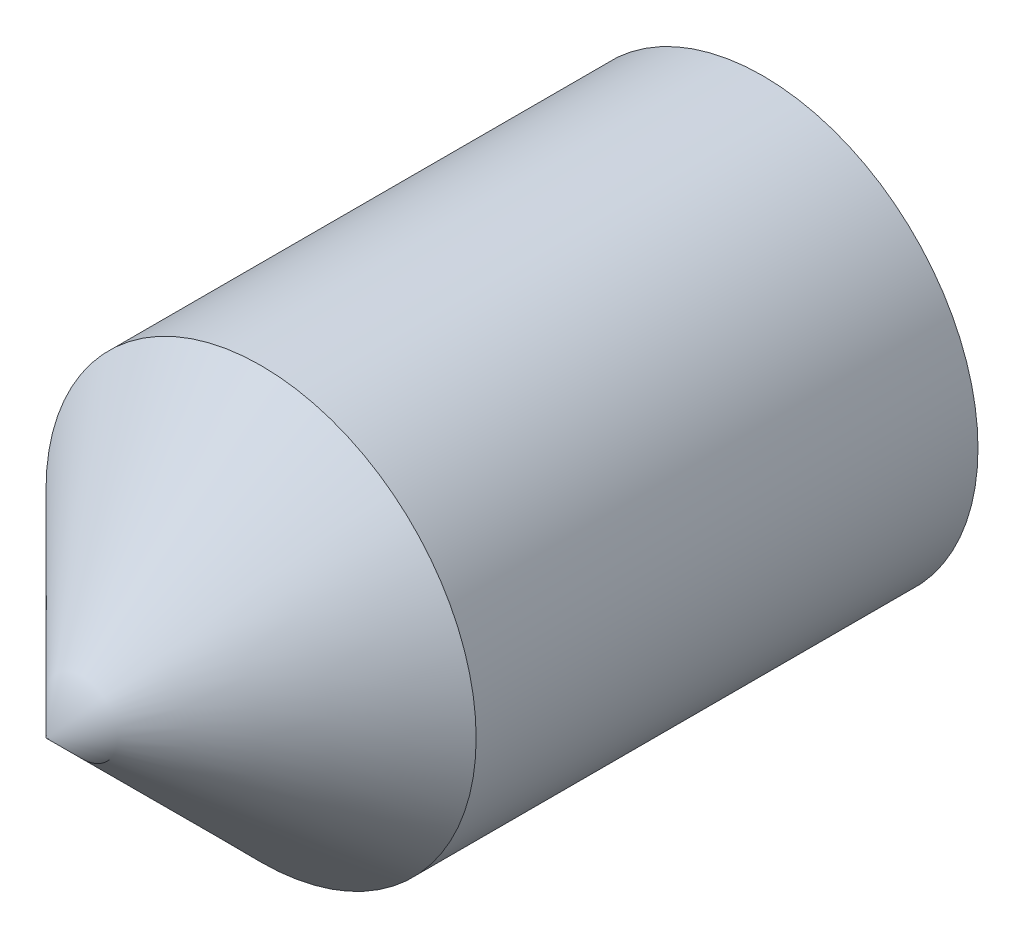
ISO-10303-21;
HEADER;
FILE_DESCRIPTION(('STEP AP214'),'2;1');
FILE_NAME('part.step','',(''),(''),'','','');
FILE_SCHEMA(('AUTOMOTIVE_DESIGN { 1 0 10303 214 1 1 1 1 }'));
ENDSEC;
DATA;
#1=APPLICATION_CONTEXT('core data for automotive mechanical design processes');
#2=APPLICATION_PROTOCOL_DEFINITION('international standard','automotive_design',2000,#1);
#3=PRODUCT_CONTEXT('',#1,'mechanical');
#4=PRODUCT('Part','Part','',(#3));
#5=PRODUCT_RELATED_PRODUCT_CATEGORY('part','',(#4));
#6=PRODUCT_DEFINITION_FORMATION('','',#4);
#7=PRODUCT_DEFINITION_CONTEXT('part definition',#1,'design');
#8=PRODUCT_DEFINITION('design','',#6,#7);
#9=PRODUCT_DEFINITION_SHAPE('','',#8);
#10=(LENGTH_UNIT() NAMED_UNIT(*) SI_UNIT(.MILLI.,.METRE.));
#11=(NAMED_UNIT(*) PLANE_ANGLE_UNIT() SI_UNIT($,.RADIAN.));
#12=(NAMED_UNIT(*) SI_UNIT($,.STERADIAN.) SOLID_ANGLE_UNIT());
#13=UNCERTAINTY_MEASURE_WITH_UNIT(LENGTH_MEASURE(1.E-05),#10,'distance_accuracy_value','');
#14=(GEOMETRIC_REPRESENTATION_CONTEXT(3) GLOBAL_UNCERTAINTY_ASSIGNED_CONTEXT((#13)) GLOBAL_UNIT_ASSIGNED_CONTEXT((#10,
#11,#12)) REPRESENTATION_CONTEXT('',''));
#15=CARTESIAN_POINT('',(0.,0.,0.));
#16=DIRECTION('',(0.,0.,1.));
#17=DIRECTION('',(1.,0.,0.));
#18=AXIS2_PLACEMENT_3D('',#15,#16,#17);
#19=CARTESIAN_POINT('',(0.,0.,25.));
#20=DIRECTION('',(0.,0.,-1.));
#21=DIRECTION('',(-1.,0.,0.));
#22=AXIS2_PLACEMENT_3D('',#19,#20,#21);
#23=CYLINDRICAL_SURFACE('',#22,7.5);
#24=CARTESIAN_POINT('',(0.,0.,17.5));
#25=DIRECTION('',(0.,0.,1.));
#26=DIRECTION('',(1.,0.,0.));
#27=AXIS2_PLACEMENT_3D('',#24,#25,#26);
#28=CIRCLE('',#27,7.5);
#29=CARTESIAN_POINT('',(7.5,0.,17.5));
#30=VERTEX_POINT('',#29);
#31=EDGE_CURVE('E11',#30,#30,#28,.F.);
#32=ORIENTED_EDGE('',*,*,#31,.T.);
#33=EDGE_LOOP('',(#32));
#34=FACE_BOUND('',#33,.T.);
#35=CARTESIAN_POINT('',(0.,0.,0.));
#36=DIRECTION('',(0.,0.,1.));
#37=DIRECTION('',(1.,0.,0.));
#38=AXIS2_PLACEMENT_3D('',#35,#36,#37);
#39=CIRCLE('',#38,7.5);
#40=CARTESIAN_POINT('',(7.5,0.,0.));
#41=VERTEX_POINT('',#40);
#42=EDGE_CURVE('E54',#41,#41,#39,.T.);
#43=ORIENTED_EDGE('',*,*,#42,.T.);
#44=EDGE_LOOP('',(#43));
#45=FACE_BOUND('',#44,.T.);
#46=ADVANCED_FACE('F45',(#34,#45),#23,.T.);
#47=CARTESIAN_POINT('',(0.,0.,0.));
#48=DIRECTION('',(0.,0.,1.));
#49=DIRECTION('',(1.,0.,0.));
#50=AXIS2_PLACEMENT_3D('',#47,#48,#49);
#51=PLANE('',#50);
#52=ORIENTED_EDGE('',*,*,#42,.F.);
#53=EDGE_LOOP('',(#52));
#54=FACE_BOUND('',#53,.T.);
#55=ADVANCED_FACE('F58',(#54),#51,.F.);
#56=CARTESIAN_POINT('',(0.,0.,17.5));
#57=DIRECTION('',(0.,0.,-1.));
#58=DIRECTION('',(-1.,0.,0.));
#59=AXIS2_PLACEMENT_3D('',#56,#57,#58);
#60=CONICAL_SURFACE('',#59,7.5,0.785398163397447);
#61=ORIENTED_EDGE('',*,*,#31,.F.);
#62=EDGE_LOOP('',(#61));
#63=FACE_BOUND('',#62,.T.);
#64=CARTESIAN_POINT('',(0.,0.,25.));
#65=VERTEX_POINT('',#64);
#66=VERTEX_LOOP('',#65);
#67=FACE_BOUND('',#66,.T.);
#68=ADVANCED_FACE('F48',(#63,#67),#60,.T.);
#69=CLOSED_SHELL('',(#46,#55,#68));
#70=MANIFOLD_SOLID_BREP('B2',#69);
#71=ADVANCED_BREP_SHAPE_REPRESENTATION('',(#18,#70),#14);
#72=SHAPE_DEFINITION_REPRESENTATION(#9,#71);
ENDSEC;
END-ISO-10303-21;
